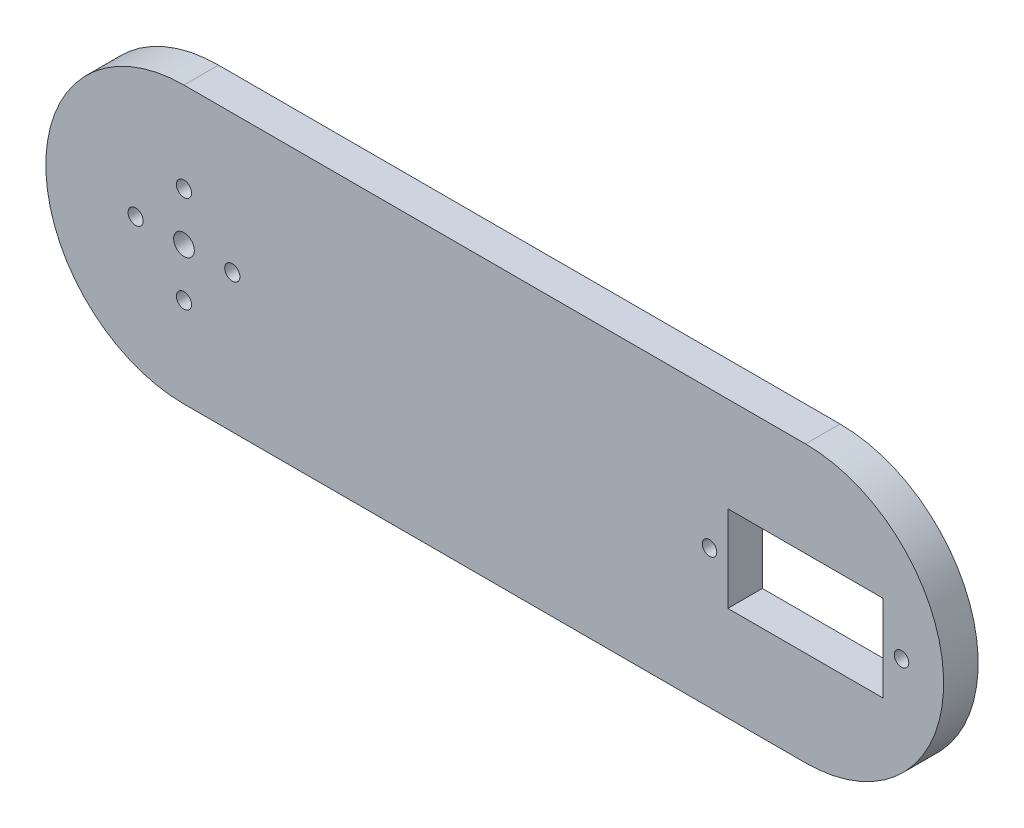
ISO-10303-21;
HEADER;
FILE_DESCRIPTION(('STEP AP214'),'2;1');
FILE_NAME('part.step','',(''),(''),'','','');
FILE_SCHEMA(('AUTOMOTIVE_DESIGN { 1 0 10303 214 1 1 1 1 }'));
ENDSEC;
DATA;
#1=APPLICATION_CONTEXT('core data for automotive mechanical design processes');
#2=APPLICATION_PROTOCOL_DEFINITION('international standard','automotive_design',2000,#1);
#3=PRODUCT_CONTEXT('',#1,'mechanical');
#4=PRODUCT('Part','Part','',(#3));
#5=PRODUCT_RELATED_PRODUCT_CATEGORY('part','',(#4));
#6=PRODUCT_DEFINITION_FORMATION('','',#4);
#7=PRODUCT_DEFINITION_CONTEXT('part definition',#1,'design');
#8=PRODUCT_DEFINITION('design','',#6,#7);
#9=PRODUCT_DEFINITION_SHAPE('','',#8);
#10=(LENGTH_UNIT() NAMED_UNIT(*) SI_UNIT(.MILLI.,.METRE.));
#11=(NAMED_UNIT(*) PLANE_ANGLE_UNIT() SI_UNIT($,.RADIAN.));
#12=(NAMED_UNIT(*) SI_UNIT($,.STERADIAN.) SOLID_ANGLE_UNIT());
#13=UNCERTAINTY_MEASURE_WITH_UNIT(LENGTH_MEASURE(1.E-05),#10,'distance_accuracy_value','');
#14=(GEOMETRIC_REPRESENTATION_CONTEXT(3) GLOBAL_UNCERTAINTY_ASSIGNED_CONTEXT((#13)) GLOBAL_UNIT_ASSIGNED_CONTEXT((#10,
#11,#12)) REPRESENTATION_CONTEXT('',''));
#15=CARTESIAN_POINT('',(0.,0.,0.));
#16=DIRECTION('',(0.,0.,1.));
#17=DIRECTION('',(1.,0.,0.));
#18=AXIS2_PLACEMENT_3D('',#15,#16,#17);
#19=CARTESIAN_POINT('',(0.,0.,0.));
#20=DIRECTION('',(0.,0.,-1.));
#21=DIRECTION('',(0.,1.,0.));
#22=AXIS2_PLACEMENT_3D('',#19,#20,#21);
#23=CYLINDRICAL_SURFACE('',#22,20.);
#24=CARTESIAN_POINT('',(0.,0.,-5.));
#25=DIRECTION('',(0.,0.,1.));
#26=DIRECTION('',(0.,-1.,0.));
#27=AXIS2_PLACEMENT_3D('',#24,#25,#26);
#28=CIRCLE('',#27,20.);
#29=CARTESIAN_POINT('',(0.,20.,-4.99999999999993));
#30=VERTEX_POINT('',#29);
#31=CARTESIAN_POINT('',(0.,-20.,-5.00000000000007));
#32=VERTEX_POINT('',#31);
#33=EDGE_CURVE('E145',#30,#32,#28,.T.);
#34=ORIENTED_EDGE('',*,*,#33,.T.);
#35=DIRECTION('',(0.,0.,-1.));
#36=VECTOR('',#35,1.);
#37=CARTESIAN_POINT('',(0.,-20.,0.));
#38=LINE('',#37,#36);
#39=CARTESIAN_POINT('',(0.,-20.,0.));
#40=VERTEX_POINT('',#39);
#41=EDGE_CURVE('E11',#40,#32,#38,.T.);
#42=ORIENTED_EDGE('',*,*,#41,.F.);
#43=CARTESIAN_POINT('',(0.,0.,0.));
#44=DIRECTION('',(0.,0.,1.));
#45=DIRECTION('',(0.,-1.,0.));
#46=AXIS2_PLACEMENT_3D('',#43,#44,#45);
#47=CIRCLE('',#46,20.);
#48=CARTESIAN_POINT('',(0.,20.,0.));
#49=VERTEX_POINT('',#48);
#50=EDGE_CURVE('E170',#49,#40,#47,.T.);
#51=ORIENTED_EDGE('',*,*,#50,.F.);
#52=DIRECTION('',(0.,0.,-1.));
#53=VECTOR('',#52,1.);
#54=CARTESIAN_POINT('',(0.,20.,0.));
#55=LINE('',#54,#53);
#56=EDGE_CURVE('E181',#49,#30,#55,.T.);
#57=ORIENTED_EDGE('',*,*,#56,.T.);
#58=EDGE_LOOP('',(#34,#42,#51,#57));
#59=FACE_BOUND('',#58,.T.);
#60=ADVANCED_FACE('F36',(#59),#23,.T.);
#61=CARTESIAN_POINT('',(90.,-20.,0.));
#62=DIRECTION('',(0.,-1.,0.));
#63=DIRECTION('',(1.,0.,0.));
#64=AXIS2_PLACEMENT_3D('',#61,#62,#63);
#65=PLANE('',#64);
#66=DIRECTION('',(-1.,0.,0.));
#67=VECTOR('',#66,1.);
#68=CARTESIAN_POINT('',(90.,-20.,-5.00000000000007));
#69=LINE('',#68,#67);
#70=CARTESIAN_POINT('',(90.,-20.,-5.00000000000007));
#71=VERTEX_POINT('',#70);
#72=EDGE_CURVE('E184',#71,#32,#69,.T.);
#73=ORIENTED_EDGE('',*,*,#72,.F.);
#74=DIRECTION('',(0.,0.,-1.));
#75=VECTOR('',#74,1.);
#76=CARTESIAN_POINT('',(90.,-20.,0.));
#77=LINE('',#76,#75);
#78=CARTESIAN_POINT('',(90.,-20.,0.));
#79=VERTEX_POINT('',#78);
#80=EDGE_CURVE('E43',#79,#71,#77,.T.);
#81=ORIENTED_EDGE('',*,*,#80,.F.);
#82=DIRECTION('',(-1.,0.,0.));
#83=VECTOR('',#82,1.);
#84=CARTESIAN_POINT('',(90.,-20.,0.));
#85=LINE('',#84,#83);
#86=EDGE_CURVE('E172',#79,#40,#85,.T.);
#87=ORIENTED_EDGE('',*,*,#86,.T.);
#88=ORIENTED_EDGE('',*,*,#41,.T.);
#89=EDGE_LOOP('',(#73,#81,#87,#88));
#90=FACE_BOUND('',#89,.T.);
#91=ADVANCED_FACE('F205',(#90),#65,.T.);
#92=CARTESIAN_POINT('',(90.,0.,0.));
#93=DIRECTION('',(0.,0.,-1.));
#94=DIRECTION('',(0.,1.,0.));
#95=AXIS2_PLACEMENT_3D('',#92,#93,#94);
#96=CYLINDRICAL_SURFACE('',#95,20.);
#97=CARTESIAN_POINT('',(90.,0.,-5.));
#98=DIRECTION('',(0.,0.,1.));
#99=DIRECTION('',(0.,-1.,0.));
#100=AXIS2_PLACEMENT_3D('',#97,#98,#99);
#101=CIRCLE('',#100,20.);
#102=CARTESIAN_POINT('',(90.,20.,-4.99999999999993));
#103=VERTEX_POINT('',#102);
#104=EDGE_CURVE('E187',#71,#103,#101,.T.);
#105=ORIENTED_EDGE('',*,*,#104,.T.);
#106=DIRECTION('',(0.,0.,-1.));
#107=VECTOR('',#106,1.);
#108=CARTESIAN_POINT('',(90.,20.,0.));
#109=LINE('',#108,#107);
#110=CARTESIAN_POINT('',(90.,20.,0.));
#111=VERTEX_POINT('',#110);
#112=EDGE_CURVE('E193',#111,#103,#109,.T.);
#113=ORIENTED_EDGE('',*,*,#112,.F.);
#114=CARTESIAN_POINT('',(90.,0.,0.));
#115=DIRECTION('',(0.,0.,1.));
#116=DIRECTION('',(0.,-1.,0.));
#117=AXIS2_PLACEMENT_3D('',#114,#115,#116);
#118=CIRCLE('',#117,20.);
#119=EDGE_CURVE('E176',#79,#111,#118,.T.);
#120=ORIENTED_EDGE('',*,*,#119,.F.);
#121=ORIENTED_EDGE('',*,*,#80,.T.);
#122=EDGE_LOOP('',(#105,#113,#120,#121));
#123=FACE_BOUND('',#122,.T.);
#124=ADVANCED_FACE('F197',(#123),#96,.T.);
#125=CARTESIAN_POINT('',(0.,20.,0.));
#126=DIRECTION('',(0.,1.,0.));
#127=DIRECTION('',(-1.,0.,0.));
#128=AXIS2_PLACEMENT_3D('',#125,#126,#127);
#129=PLANE('',#128);
#130=DIRECTION('',(1.,0.,0.));
#131=VECTOR('',#130,1.);
#132=CARTESIAN_POINT('',(0.,20.,-4.99999999999993));
#133=LINE('',#132,#131);
#134=EDGE_CURVE('E173',#30,#103,#133,.T.);
#135=ORIENTED_EDGE('',*,*,#134,.F.);
#136=ORIENTED_EDGE('',*,*,#56,.F.);
#137=DIRECTION('',(1.,0.,0.));
#138=VECTOR('',#137,1.);
#139=CARTESIAN_POINT('',(0.,20.,0.));
#140=LINE('',#139,#138);
#141=EDGE_CURVE('E178',#49,#111,#140,.T.);
#142=ORIENTED_EDGE('',*,*,#141,.T.);
#143=ORIENTED_EDGE('',*,*,#112,.T.);
#144=EDGE_LOOP('',(#135,#136,#142,#143));
#145=FACE_BOUND('',#144,.T.);
#146=ADVANCED_FACE('F210',(#145),#129,.T.);
#147=CARTESIAN_POINT('',(0.,0.,0.));
#148=DIRECTION('',(0.,0.,1.));
#149=DIRECTION('',(0.,-1.,0.));
#150=AXIS2_PLACEMENT_3D('',#147,#148,#149);
#151=PLANE('',#150);
#152=CARTESIAN_POINT('',(76.1,0.,0.));
#153=DIRECTION('',(0.,0.,1.));
#154=DIRECTION('',(-1.,0.,0.));
#155=AXIS2_PLACEMENT_3D('',#152,#153,#154);
#156=CIRCLE('',#155,1.04999999999999);
#157=CARTESIAN_POINT('',(75.05,0.,0.));
#158=VERTEX_POINT('',#157);
#159=EDGE_CURVE('E367',#158,#158,#156,.T.);
#160=ORIENTED_EDGE('',*,*,#159,.F.);
#161=EDGE_LOOP('',(#160));
#162=FACE_BOUND('',#161,.T.);
#163=CARTESIAN_POINT('',(103.9,0.,0.));
#164=DIRECTION('',(0.,0.,1.));
#165=DIRECTION('',(1.,0.,0.));
#166=AXIS2_PLACEMENT_3D('',#163,#164,#165);
#167=CIRCLE('',#166,1.04999999999999);
#168=CARTESIAN_POINT('',(104.95,0.,0.));
#169=VERTEX_POINT('',#168);
#170=EDGE_CURVE('E123',#169,#169,#167,.T.);
#171=ORIENTED_EDGE('',*,*,#170,.F.);
#172=EDGE_LOOP('',(#171));
#173=FACE_BOUND('',#172,.T.);
#174=DIRECTION('',(0.,1.,0.));
#175=VECTOR('',#174,1.);
#176=CARTESIAN_POINT('',(101.25,-6.25000000000002,0.));
#177=LINE('',#176,#175);
#178=CARTESIAN_POINT('',(101.25,-6.25000000000002,0.));
#179=VERTEX_POINT('',#178);
#180=CARTESIAN_POINT('',(101.25,6.24999999999998,0.));
#181=VERTEX_POINT('',#180);
#182=EDGE_CURVE('E50',#179,#181,#177,.T.);
#183=ORIENTED_EDGE('',*,*,#182,.F.);
#184=DIRECTION('',(1.,0.,0.));
#185=VECTOR('',#184,1.);
#186=CARTESIAN_POINT('',(78.75,-6.25000000000002,0.));
#187=LINE('',#186,#185);
#188=CARTESIAN_POINT('',(78.75,-6.25000000000002,0.));
#189=VERTEX_POINT('',#188);
#190=EDGE_CURVE('E117',#189,#179,#187,.T.);
#191=ORIENTED_EDGE('',*,*,#190,.F.);
#192=DIRECTION('',(0.,-1.,0.));
#193=VECTOR('',#192,1.);
#194=CARTESIAN_POINT('',(78.75,-6.25000000000002,0.));
#195=LINE('',#194,#193);
#196=CARTESIAN_POINT('',(78.75,6.24999999999998,0.));
#197=VERTEX_POINT('',#196);
#198=EDGE_CURVE('E120',#197,#189,#195,.T.);
#199=ORIENTED_EDGE('',*,*,#198,.F.);
#200=DIRECTION('',(-1.,0.,0.));
#201=VECTOR('',#200,1.);
#202=CARTESIAN_POINT('',(78.75,6.24999999999998,0.));
#203=LINE('',#202,#201);
#204=EDGE_CURVE('E129',#181,#197,#203,.T.);
#205=ORIENTED_EDGE('',*,*,#204,.F.);
#206=EDGE_LOOP('',(#183,#191,#199,#205));
#207=FACE_BOUND('',#206,.T.);
#208=CARTESIAN_POINT('',(0.,6.99999999999998,0.));
#209=DIRECTION('',(0.,0.,1.));
#210=DIRECTION('',(0.,-1.,0.));
#211=AXIS2_PLACEMENT_3D('',#208,#209,#210);
#212=CIRCLE('',#211,1.1);
#213=CARTESIAN_POINT('',(0.,5.89999999999998,0.));
#214=VERTEX_POINT('',#213);
#215=EDGE_CURVE('E138',#214,#214,#212,.T.);
#216=ORIENTED_EDGE('',*,*,#215,.F.);
#217=EDGE_LOOP('',(#216));
#218=FACE_BOUND('',#217,.T.);
#219=CARTESIAN_POINT('',(-6.999,-0.00100000000001874,0.));
#220=DIRECTION('',(0.,0.,1.));
#221=DIRECTION('',(0.,-1.,0.));
#222=AXIS2_PLACEMENT_3D('',#219,#220,#221);
#223=CIRCLE('',#222,1.1);
#224=CARTESIAN_POINT('',(-6.999,-1.10100000000002,0.));
#225=VERTEX_POINT('',#224);
#226=EDGE_CURVE('E150',#225,#225,#223,.T.);
#227=ORIENTED_EDGE('',*,*,#226,.F.);
#228=EDGE_LOOP('',(#227));
#229=FACE_BOUND('',#228,.T.);
#230=CARTESIAN_POINT('',(0.00200000000000086,-7.00000000000002,0.));
#231=DIRECTION('',(0.,0.,1.));
#232=DIRECTION('',(0.,-1.,0.));
#233=AXIS2_PLACEMENT_3D('',#230,#231,#232);
#234=CIRCLE('',#233,1.1);
#235=CARTESIAN_POINT('',(0.00200000000000086,-8.10000000000002,0.));
#236=VERTEX_POINT('',#235);
#237=EDGE_CURVE('E149',#236,#236,#234,.T.);
#238=ORIENTED_EDGE('',*,*,#237,.F.);
#239=EDGE_LOOP('',(#238));
#240=FACE_BOUND('',#239,.T.);
#241=CARTESIAN_POINT('',(7.001,0.000999999999982971,0.));
#242=DIRECTION('',(0.,0.,1.));
#243=DIRECTION('',(0.,-1.,0.));
#244=AXIS2_PLACEMENT_3D('',#241,#242,#243);
#245=CIRCLE('',#244,1.1);
#246=CARTESIAN_POINT('',(7.001,-1.09900000000002,0.));
#247=VERTEX_POINT('',#246);
#248=EDGE_CURVE('E163',#247,#247,#245,.T.);
#249=ORIENTED_EDGE('',*,*,#248,.F.);
#250=EDGE_LOOP('',(#249));
#251=FACE_BOUND('',#250,.T.);
#252=CARTESIAN_POINT('',(0.,0.,0.));
#253=DIRECTION('',(0.,0.,1.));
#254=DIRECTION('',(0.,-1.,0.));
#255=AXIS2_PLACEMENT_3D('',#252,#253,#254);
#256=CIRCLE('',#255,1.5);
#257=CARTESIAN_POINT('',(0.,-1.50000000000002,0.));
#258=VERTEX_POINT('',#257);
#259=EDGE_CURVE('E142',#258,#258,#256,.T.);
#260=ORIENTED_EDGE('',*,*,#259,.F.);
#261=EDGE_LOOP('',(#260));
#262=FACE_BOUND('',#261,.T.);
#263=ORIENTED_EDGE('',*,*,#50,.T.);
#264=ORIENTED_EDGE('',*,*,#86,.F.);
#265=ORIENTED_EDGE('',*,*,#119,.T.);
#266=ORIENTED_EDGE('',*,*,#141,.F.);
#267=EDGE_LOOP('',(#263,#264,#265,#266));
#268=FACE_BOUND('',#267,.T.);
#269=ADVANCED_FACE('F213',(#162,#173,#207,#218,#229,#240,#251,#262,#268),#151,.T.);
#270=CARTESIAN_POINT('',(0.,0.,-5.));
#271=DIRECTION('',(0.,0.,1.));
#272=DIRECTION('',(0.,-1.,0.));
#273=AXIS2_PLACEMENT_3D('',#270,#271,#272);
#274=PLANE('',#273);
#275=CARTESIAN_POINT('',(76.1,0.,-5.00000000000007));
#276=DIRECTION('',(0.,0.,1.));
#277=DIRECTION('',(-1.,0.,0.));
#278=AXIS2_PLACEMENT_3D('',#275,#276,#277);
#279=CIRCLE('',#278,1.04999999999999);
#280=CARTESIAN_POINT('',(75.05,0.,-5.00000000000007));
#281=VERTEX_POINT('',#280);
#282=EDGE_CURVE('E157',#281,#281,#279,.T.);
#283=ORIENTED_EDGE('',*,*,#282,.T.);
#284=EDGE_LOOP('',(#283));
#285=FACE_BOUND('',#284,.T.);
#286=CARTESIAN_POINT('',(103.9,0.,-5.00000000000007));
#287=DIRECTION('',(0.,0.,1.));
#288=DIRECTION('',(1.,0.,0.));
#289=AXIS2_PLACEMENT_3D('',#286,#287,#288);
#290=CIRCLE('',#289,1.04999999999999);
#291=CARTESIAN_POINT('',(104.95,0.,-5.00000000000007));
#292=VERTEX_POINT('',#291);
#293=EDGE_CURVE('E368',#292,#292,#290,.T.);
#294=ORIENTED_EDGE('',*,*,#293,.T.);
#295=EDGE_LOOP('',(#294));
#296=FACE_BOUND('',#295,.T.);
#297=DIRECTION('',(1.,0.,0.));
#298=VECTOR('',#297,1.);
#299=CARTESIAN_POINT('',(78.75,-6.25000000000002,-5.00000000000007));
#300=LINE('',#299,#298);
#301=CARTESIAN_POINT('',(78.75,-6.25000000000002,-5.00000000000007));
#302=VERTEX_POINT('',#301);
#303=CARTESIAN_POINT('',(101.25,-6.25000000000002,-5.00000000000007));
#304=VERTEX_POINT('',#303);
#305=EDGE_CURVE('E107',#302,#304,#300,.T.);
#306=ORIENTED_EDGE('',*,*,#305,.T.);
#307=DIRECTION('',(0.,1.,0.));
#308=VECTOR('',#307,1.);
#309=CARTESIAN_POINT('',(101.25,-6.25000000000002,-5.00000000000007));
#310=LINE('',#309,#308);
#311=CARTESIAN_POINT('',(101.25,6.24999999999998,-5.00000000000007));
#312=VERTEX_POINT('',#311);
#313=EDGE_CURVE('E101',#304,#312,#310,.T.);
#314=ORIENTED_EDGE('',*,*,#313,.T.);
#315=DIRECTION('',(-1.,0.,0.));
#316=VECTOR('',#315,1.);
#317=CARTESIAN_POINT('',(78.75,6.24999999999998,-5.00000000000007));
#318=LINE('',#317,#316);
#319=CARTESIAN_POINT('',(78.75,6.24999999999998,-4.99999999999998));
#320=VERTEX_POINT('',#319);
#321=EDGE_CURVE('E110',#312,#320,#318,.T.);
#322=ORIENTED_EDGE('',*,*,#321,.T.);
#323=DIRECTION('',(0.,-1.,0.));
#324=VECTOR('',#323,1.);
#325=CARTESIAN_POINT('',(78.75,-6.25000000000002,-5.00000000000007));
#326=LINE('',#325,#324);
#327=EDGE_CURVE('E58',#320,#302,#326,.T.);
#328=ORIENTED_EDGE('',*,*,#327,.T.);
#329=EDGE_LOOP('',(#306,#314,#322,#328));
#330=FACE_BOUND('',#329,.T.);
#331=CARTESIAN_POINT('',(0.,7.,-4.99999999999998));
#332=DIRECTION('',(0.,0.,1.));
#333=DIRECTION('',(0.,-1.,0.));
#334=AXIS2_PLACEMENT_3D('',#331,#332,#333);
#335=CIRCLE('',#334,1.1);
#336=CARTESIAN_POINT('',(0.,5.9,-4.99999999999998));
#337=VERTEX_POINT('',#336);
#338=EDGE_CURVE('E141',#337,#337,#335,.F.);
#339=ORIENTED_EDGE('',*,*,#338,.F.);
#340=EDGE_LOOP('',(#339));
#341=FACE_BOUND('',#340,.T.);
#342=CARTESIAN_POINT('',(-6.999,-0.00100000000000129,-5.));
#343=DIRECTION('',(0.,0.,1.));
#344=DIRECTION('',(0.,-1.,0.));
#345=AXIS2_PLACEMENT_3D('',#342,#343,#344);
#346=CIRCLE('',#345,1.1);
#347=CARTESIAN_POINT('',(-6.999,-1.101,-5.));
#348=VERTEX_POINT('',#347);
#349=EDGE_CURVE('E154',#348,#348,#346,.F.);
#350=ORIENTED_EDGE('',*,*,#349,.F.);
#351=EDGE_LOOP('',(#350));
#352=FACE_BOUND('',#351,.T.);
#353=CARTESIAN_POINT('',(0.00200000000000086,-7.,-5.00000000000002));
#354=DIRECTION('',(0.,0.,1.));
#355=DIRECTION('',(0.,-1.,0.));
#356=AXIS2_PLACEMENT_3D('',#353,#354,#355);
#357=CIRCLE('',#356,1.1);
#358=CARTESIAN_POINT('',(0.00200000000000086,-8.1,-5.00000000000003));
#359=VERTEX_POINT('',#358);
#360=EDGE_CURVE('E146',#359,#359,#357,.F.);
#361=ORIENTED_EDGE('',*,*,#360,.F.);
#362=EDGE_LOOP('',(#361));
#363=FACE_BOUND('',#362,.T.);
#364=CARTESIAN_POINT('',(7.001,0.00100000000000043,-5.));
#365=DIRECTION('',(0.,0.,1.));
#366=DIRECTION('',(0.,-1.,0.));
#367=AXIS2_PLACEMENT_3D('',#364,#365,#366);
#368=CIRCLE('',#367,1.1);
#369=CARTESIAN_POINT('',(7.001,-1.099,-5.));
#370=VERTEX_POINT('',#369);
#371=EDGE_CURVE('E153',#370,#370,#368,.F.);
#372=ORIENTED_EDGE('',*,*,#371,.F.);
#373=EDGE_LOOP('',(#372));
#374=FACE_BOUND('',#373,.T.);
#375=CARTESIAN_POINT('',(0.,0.,-5.));
#376=DIRECTION('',(0.,0.,1.));
#377=DIRECTION('',(0.,-1.,0.));
#378=AXIS2_PLACEMENT_3D('',#375,#376,#377);
#379=CIRCLE('',#378,1.5);
#380=CARTESIAN_POINT('',(0.,-1.5,-5.00000000000001));
#381=VERTEX_POINT('',#380);
#382=EDGE_CURVE('E160',#381,#381,#379,.F.);
#383=ORIENTED_EDGE('',*,*,#382,.F.);
#384=EDGE_LOOP('',(#383));
#385=FACE_BOUND('',#384,.T.);
#386=ORIENTED_EDGE('',*,*,#33,.F.);
#387=ORIENTED_EDGE('',*,*,#134,.T.);
#388=ORIENTED_EDGE('',*,*,#104,.F.);
#389=ORIENTED_EDGE('',*,*,#72,.T.);
#390=EDGE_LOOP('',(#386,#387,#388,#389));
#391=FACE_BOUND('',#390,.T.);
#392=ADVANCED_FACE('F114',(#285,#296,#330,#341,#352,#363,#374,#385,#391),#274,.F.);
#393=CARTESIAN_POINT('',(0.,0.,-5.001));
#394=DIRECTION('',(0.,0.,1.));
#395=DIRECTION('',(0.,-1.,0.));
#396=AXIS2_PLACEMENT_3D('',#393,#394,#395);
#397=CYLINDRICAL_SURFACE('',#396,1.5);
#398=ORIENTED_EDGE('',*,*,#259,.T.);
#399=EDGE_LOOP('',(#398));
#400=FACE_BOUND('',#399,.T.);
#401=ORIENTED_EDGE('',*,*,#382,.T.);
#402=EDGE_LOOP('',(#401));
#403=FACE_BOUND('',#402,.T.);
#404=ADVANCED_FACE('F221',(#400,#403),#397,.F.);
#405=CARTESIAN_POINT('',(7.001,0.00100000000000043,-5.001));
#406=DIRECTION('',(0.,0.,1.));
#407=DIRECTION('',(0.,-1.,0.));
#408=AXIS2_PLACEMENT_3D('',#405,#406,#407);
#409=CYLINDRICAL_SURFACE('',#408,1.1);
#410=ORIENTED_EDGE('',*,*,#248,.T.);
#411=EDGE_LOOP('',(#410));
#412=FACE_BOUND('',#411,.T.);
#413=ORIENTED_EDGE('',*,*,#371,.T.);
#414=EDGE_LOOP('',(#413));
#415=FACE_BOUND('',#414,.T.);
#416=ADVANCED_FACE('F265',(#412,#415),#409,.F.);
#417=CARTESIAN_POINT('',(0.00200000000000086,-7.,-5.00100000000002));
#418=DIRECTION('',(0.,0.,1.));
#419=DIRECTION('',(0.,-1.,0.));
#420=AXIS2_PLACEMENT_3D('',#417,#418,#419);
#421=CYLINDRICAL_SURFACE('',#420,1.1);
#422=ORIENTED_EDGE('',*,*,#237,.T.);
#423=EDGE_LOOP('',(#422));
#424=FACE_BOUND('',#423,.T.);
#425=ORIENTED_EDGE('',*,*,#360,.T.);
#426=EDGE_LOOP('',(#425));
#427=FACE_BOUND('',#426,.T.);
#428=ADVANCED_FACE('F275',(#424,#427),#421,.F.);
#429=CARTESIAN_POINT('',(-6.999,-0.00100000000000128,-5.001));
#430=DIRECTION('',(0.,0.,1.));
#431=DIRECTION('',(0.,-1.,0.));
#432=AXIS2_PLACEMENT_3D('',#429,#430,#431);
#433=CYLINDRICAL_SURFACE('',#432,1.1);
#434=ORIENTED_EDGE('',*,*,#226,.T.);
#435=EDGE_LOOP('',(#434));
#436=FACE_BOUND('',#435,.T.);
#437=ORIENTED_EDGE('',*,*,#349,.T.);
#438=EDGE_LOOP('',(#437));
#439=FACE_BOUND('',#438,.T.);
#440=ADVANCED_FACE('F284',(#436,#439),#433,.F.);
#441=CARTESIAN_POINT('',(0.,7.,-5.00099999999998));
#442=DIRECTION('',(0.,0.,1.));
#443=DIRECTION('',(0.,-1.,0.));
#444=AXIS2_PLACEMENT_3D('',#441,#442,#443);
#445=CYLINDRICAL_SURFACE('',#444,1.1);
#446=ORIENTED_EDGE('',*,*,#215,.T.);
#447=EDGE_LOOP('',(#446));
#448=FACE_BOUND('',#447,.T.);
#449=ORIENTED_EDGE('',*,*,#338,.T.);
#450=EDGE_LOOP('',(#449));
#451=FACE_BOUND('',#450,.T.);
#452=ADVANCED_FACE('F294',(#448,#451),#445,.F.);
#453=CARTESIAN_POINT('',(101.25,-6.25000000000002,-5.00000000000007));
#454=DIRECTION('',(1.,0.,0.));
#455=DIRECTION('',(0.,0.,-1.));
#456=AXIS2_PLACEMENT_3D('',#453,#454,#455);
#457=PLANE('',#456);
#458=ORIENTED_EDGE('',*,*,#182,.T.);
#459=DIRECTION('',(0.,0.,1.));
#460=VECTOR('',#459,1.);
#461=CARTESIAN_POINT('',(101.25,6.24999999999998,-5.00000000000007));
#462=LINE('',#461,#460);
#463=EDGE_CURVE('E97',#312,#181,#462,.T.);
#464=ORIENTED_EDGE('',*,*,#463,.F.);
#465=ORIENTED_EDGE('',*,*,#313,.F.);
#466=DIRECTION('',(0.,0.,1.));
#467=VECTOR('',#466,1.);
#468=CARTESIAN_POINT('',(101.25,-6.25000000000002,-5.00000000000007));
#469=LINE('',#468,#467);
#470=EDGE_CURVE('E133',#304,#179,#469,.T.);
#471=ORIENTED_EDGE('',*,*,#470,.T.);
#472=EDGE_LOOP('',(#458,#464,#465,#471));
#473=FACE_BOUND('',#472,.T.);
#474=ADVANCED_FACE('F99',(#473),#457,.F.);
#475=CARTESIAN_POINT('',(78.75,-6.25000000000002,-5.00000000000007));
#476=DIRECTION('',(0.,-1.,0.));
#477=DIRECTION('',(0.,0.,-1.));
#478=AXIS2_PLACEMENT_3D('',#475,#476,#477);
#479=PLANE('',#478);
#480=ORIENTED_EDGE('',*,*,#190,.T.);
#481=ORIENTED_EDGE('',*,*,#470,.F.);
#482=ORIENTED_EDGE('',*,*,#305,.F.);
#483=DIRECTION('',(0.,0.,1.));
#484=VECTOR('',#483,1.);
#485=CARTESIAN_POINT('',(78.75,-6.25000000000002,-5.00000000000007));
#486=LINE('',#485,#484);
#487=EDGE_CURVE('E135',#302,#189,#486,.T.);
#488=ORIENTED_EDGE('',*,*,#487,.T.);
#489=EDGE_LOOP('',(#480,#481,#482,#488));
#490=FACE_BOUND('',#489,.T.);
#491=ADVANCED_FACE('F313',(#490),#479,.F.);
#492=CARTESIAN_POINT('',(78.75,-6.25000000000002,-5.00000000000007));
#493=DIRECTION('',(-1.,0.,0.));
#494=DIRECTION('',(0.,0.,1.));
#495=AXIS2_PLACEMENT_3D('',#492,#493,#494);
#496=PLANE('',#495);
#497=ORIENTED_EDGE('',*,*,#198,.T.);
#498=ORIENTED_EDGE('',*,*,#487,.F.);
#499=ORIENTED_EDGE('',*,*,#327,.F.);
#500=DIRECTION('',(0.,0.,1.));
#501=VECTOR('',#500,1.);
#502=CARTESIAN_POINT('',(78.75,6.24999999999998,-5.00000000000007));
#503=LINE('',#502,#501);
#504=EDGE_CURVE('E106',#320,#197,#503,.T.);
#505=ORIENTED_EDGE('',*,*,#504,.T.);
#506=EDGE_LOOP('',(#497,#498,#499,#505));
#507=FACE_BOUND('',#506,.T.);
#508=ADVANCED_FACE('F322',(#507),#496,.F.);
#509=CARTESIAN_POINT('',(78.75,6.24999999999998,-5.00000000000007));
#510=DIRECTION('',(0.,1.,0.));
#511=DIRECTION('',(0.,0.,1.));
#512=AXIS2_PLACEMENT_3D('',#509,#510,#511);
#513=PLANE('',#512);
#514=ORIENTED_EDGE('',*,*,#204,.T.);
#515=ORIENTED_EDGE('',*,*,#504,.F.);
#516=ORIENTED_EDGE('',*,*,#321,.F.);
#517=ORIENTED_EDGE('',*,*,#463,.T.);
#518=EDGE_LOOP('',(#514,#515,#516,#517));
#519=FACE_BOUND('',#518,.T.);
#520=ADVANCED_FACE('F111',(#519),#513,.F.);
#521=CARTESIAN_POINT('',(103.9,0.,-5.00000000000007));
#522=DIRECTION('',(0.,0.,1.));
#523=DIRECTION('',(1.,0.,0.));
#524=AXIS2_PLACEMENT_3D('',#521,#522,#523);
#525=CYLINDRICAL_SURFACE('',#524,1.04999999999999);
#526=ORIENTED_EDGE('',*,*,#293,.F.);
#527=EDGE_LOOP('',(#526));
#528=FACE_BOUND('',#527,.T.);
#529=ORIENTED_EDGE('',*,*,#170,.T.);
#530=EDGE_LOOP('',(#529));
#531=FACE_BOUND('',#530,.T.);
#532=ADVANCED_FACE('F340',(#528,#531),#525,.F.);
#533=CARTESIAN_POINT('',(76.1,0.,-5.00000000000007));
#534=DIRECTION('',(0.,0.,1.));
#535=DIRECTION('',(1.,0.,0.));
#536=AXIS2_PLACEMENT_3D('',#533,#534,#535);
#537=CYLINDRICAL_SURFACE('',#536,1.04999999999999);
#538=ORIENTED_EDGE('',*,*,#282,.F.);
#539=EDGE_LOOP('',(#538));
#540=FACE_BOUND('',#539,.T.);
#541=ORIENTED_EDGE('',*,*,#159,.T.);
#542=EDGE_LOOP('',(#541));
#543=FACE_BOUND('',#542,.T.);
#544=ADVANCED_FACE('F349',(#540,#543),#537,.F.);
#545=CLOSED_SHELL('',(#60,#91,#124,#146,#269,#392,#404,#416,#428,#440,#452,#474,#491,#508,#520,
#532,#544));
#546=MANIFOLD_SOLID_BREP('B2',#545);
#547=ADVANCED_BREP_SHAPE_REPRESENTATION('',(#18,#546),#14);
#548=SHAPE_DEFINITION_REPRESENTATION(#9,#547);
ENDSEC;
END-ISO-10303-21;
